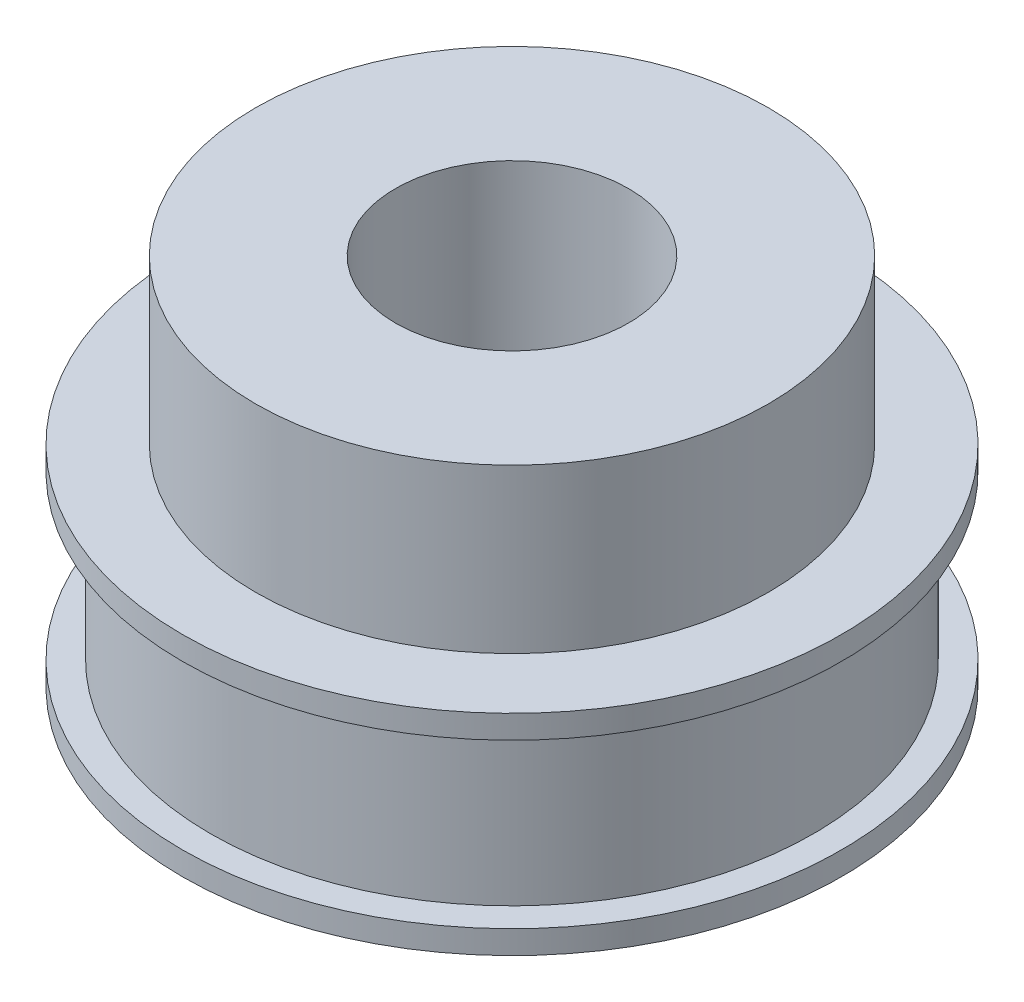
ISO-10303-21;
HEADER;
FILE_DESCRIPTION(('STEP AP214'),'2;1');
FILE_NAME('part.step','',(''),(''),'','','');
FILE_SCHEMA(('AUTOMOTIVE_DESIGN { 1 0 10303 214 1 1 1 1 }'));
ENDSEC;
DATA;
#1=APPLICATION_CONTEXT('core data for automotive mechanical design processes');
#2=APPLICATION_PROTOCOL_DEFINITION('international standard','automotive_design',2000,#1);
#3=PRODUCT_CONTEXT('',#1,'mechanical');
#4=PRODUCT('Part','Part','',(#3));
#5=PRODUCT_RELATED_PRODUCT_CATEGORY('part','',(#4));
#6=PRODUCT_DEFINITION_FORMATION('','',#4);
#7=PRODUCT_DEFINITION_CONTEXT('part definition',#1,'design');
#8=PRODUCT_DEFINITION('design','',#6,#7);
#9=PRODUCT_DEFINITION_SHAPE('','',#8);
#10=(LENGTH_UNIT() NAMED_UNIT(*) SI_UNIT(.MILLI.,.METRE.));
#11=(NAMED_UNIT(*) PLANE_ANGLE_UNIT() SI_UNIT($,.RADIAN.));
#12=(NAMED_UNIT(*) SI_UNIT($,.STERADIAN.) SOLID_ANGLE_UNIT());
#13=UNCERTAINTY_MEASURE_WITH_UNIT(LENGTH_MEASURE(1.E-05),#10,'distance_accuracy_value','');
#14=(GEOMETRIC_REPRESENTATION_CONTEXT(3) GLOBAL_UNCERTAINTY_ASSIGNED_CONTEXT((#13)) GLOBAL_UNIT_ASSIGNED_CONTEXT((#10,
#11,#12)) REPRESENTATION_CONTEXT('',''));
#15=CARTESIAN_POINT('',(0.,0.,0.));
#16=DIRECTION('',(0.,0.,1.));
#17=DIRECTION('',(1.,0.,0.));
#18=AXIS2_PLACEMENT_3D('',#15,#16,#17);
#19=CARTESIAN_POINT('',(0.,7.,0.));
#20=DIRECTION('',(0.,-1.,0.));
#21=DIRECTION('',(0.,0.,-1.));
#22=AXIS2_PLACEMENT_3D('',#19,#20,#21);
#23=CYLINDRICAL_SURFACE('',#22,12.935);
#24=CARTESIAN_POINT('',(0.,7.,0.));
#25=DIRECTION('',(0.,1.,0.));
#26=DIRECTION('',(0.,0.,1.));
#27=AXIS2_PLACEMENT_3D('',#24,#25,#26);
#28=CIRCLE('',#27,12.935);
#29=CARTESIAN_POINT('',(0.,7.,12.935));
#30=VERTEX_POINT('',#29);
#31=EDGE_CURVE('E42',#30,#30,#28,.T.);
#32=ORIENTED_EDGE('',*,*,#31,.F.);
#33=EDGE_LOOP('',(#32));
#34=FACE_BOUND('',#33,.T.);
#35=CARTESIAN_POINT('',(0.,0.,0.));
#36=DIRECTION('',(0.,1.,0.));
#37=DIRECTION('',(0.,0.,1.));
#38=AXIS2_PLACEMENT_3D('',#35,#36,#37);
#39=CIRCLE('',#38,12.935);
#40=CARTESIAN_POINT('',(0.,0.,12.935));
#41=VERTEX_POINT('',#40);
#42=EDGE_CURVE('E38',#41,#41,#39,.T.);
#43=ORIENTED_EDGE('',*,*,#42,.T.);
#44=EDGE_LOOP('',(#43));
#45=FACE_BOUND('',#44,.T.);
#46=ADVANCED_FACE('F35',(#34,#45),#23,.T.);
#47=CARTESIAN_POINT('',(0.,8.,0.));
#48=DIRECTION('',(0.,-1.,0.));
#49=DIRECTION('',(0.,0.,-1.));
#50=AXIS2_PLACEMENT_3D('',#47,#48,#49);
#51=CYLINDRICAL_SURFACE('',#50,14.135);
#52=CARTESIAN_POINT('',(0.,8.,0.));
#53=DIRECTION('',(0.,1.,0.));
#54=DIRECTION('',(0.,0.,1.));
#55=AXIS2_PLACEMENT_3D('',#52,#53,#54);
#56=CIRCLE('',#55,14.135);
#57=CARTESIAN_POINT('',(0.,8.,14.135));
#58=VERTEX_POINT('',#57);
#59=EDGE_CURVE('E47',#58,#58,#56,.T.);
#60=ORIENTED_EDGE('',*,*,#59,.F.);
#61=EDGE_LOOP('',(#60));
#62=FACE_BOUND('',#61,.T.);
#63=CARTESIAN_POINT('',(0.,7.,0.));
#64=DIRECTION('',(0.,1.,0.));
#65=DIRECTION('',(0.,0.,1.));
#66=AXIS2_PLACEMENT_3D('',#63,#64,#65);
#67=CIRCLE('',#66,14.135);
#68=CARTESIAN_POINT('',(0.,7.,14.135));
#69=VERTEX_POINT('',#68);
#70=EDGE_CURVE('E64',#69,#69,#67,.T.);
#71=ORIENTED_EDGE('',*,*,#70,.T.);
#72=EDGE_LOOP('',(#71));
#73=FACE_BOUND('',#72,.T.);
#74=ADVANCED_FACE('F96',(#62,#73),#51,.T.);
#75=CARTESIAN_POINT('',(0.,8.,0.));
#76=DIRECTION('',(0.,1.,0.));
#77=DIRECTION('',(0.,0.,1.));
#78=AXIS2_PLACEMENT_3D('',#75,#76,#77);
#79=PLANE('',#78);
#80=CARTESIAN_POINT('',(0.,8.,0.));
#81=DIRECTION('',(0.,1.,0.));
#82=DIRECTION('',(0.,0.,1.));
#83=AXIS2_PLACEMENT_3D('',#80,#81,#82);
#84=CIRCLE('',#83,11.);
#85=CARTESIAN_POINT('',(0.,8.,-11.));
#86=VERTEX_POINT('',#85);
#87=EDGE_CURVE('E11',#86,#86,#84,.T.);
#88=ORIENTED_EDGE('',*,*,#87,.F.);
#89=EDGE_LOOP('',(#88));
#90=FACE_BOUND('',#89,.T.);
#91=ORIENTED_EDGE('',*,*,#59,.T.);
#92=EDGE_LOOP('',(#91));
#93=FACE_BOUND('',#92,.T.);
#94=ADVANCED_FACE('F91',(#90,#93),#79,.T.);
#95=CARTESIAN_POINT('',(0.,7.,0.));
#96=DIRECTION('',(0.,1.,0.));
#97=DIRECTION('',(0.,0.,1.));
#98=AXIS2_PLACEMENT_3D('',#95,#96,#97);
#99=PLANE('',#98);
#100=ORIENTED_EDGE('',*,*,#31,.T.);
#101=EDGE_LOOP('',(#100));
#102=FACE_BOUND('',#101,.T.);
#103=ORIENTED_EDGE('',*,*,#70,.F.);
#104=EDGE_LOOP('',(#103));
#105=FACE_BOUND('',#104,.T.);
#106=ADVANCED_FACE('F82',(#102,#105),#99,.F.);
#107=CARTESIAN_POINT('',(0.,-1.,0.));
#108=DIRECTION('',(0.,1.,0.));
#109=DIRECTION('',(0.,0.,1.));
#110=AXIS2_PLACEMENT_3D('',#107,#108,#109);
#111=CYLINDRICAL_SURFACE('',#110,14.135);
#112=CARTESIAN_POINT('',(0.,-1.,0.));
#113=DIRECTION('',(0.,1.,0.));
#114=DIRECTION('',(0.,0.,1.));
#115=AXIS2_PLACEMENT_3D('',#112,#113,#114);
#116=CIRCLE('',#115,14.135);
#117=CARTESIAN_POINT('',(0.,-1.,14.135));
#118=VERTEX_POINT('',#117);
#119=EDGE_CURVE('E57',#118,#118,#116,.T.);
#120=ORIENTED_EDGE('',*,*,#119,.T.);
#121=EDGE_LOOP('',(#120));
#122=FACE_BOUND('',#121,.T.);
#123=CARTESIAN_POINT('',(0.,0.,0.));
#124=DIRECTION('',(0.,1.,0.));
#125=DIRECTION('',(0.,0.,1.));
#126=AXIS2_PLACEMENT_3D('',#123,#124,#125);
#127=CIRCLE('',#126,14.135);
#128=CARTESIAN_POINT('',(0.,0.,14.135));
#129=VERTEX_POINT('',#128);
#130=EDGE_CURVE('E55',#129,#129,#127,.T.);
#131=ORIENTED_EDGE('',*,*,#130,.F.);
#132=EDGE_LOOP('',(#131));
#133=FACE_BOUND('',#132,.T.);
#134=ADVANCED_FACE('F80',(#122,#133),#111,.T.);
#135=CARTESIAN_POINT('',(0.,-1.,0.));
#136=DIRECTION('',(0.,-1.,0.));
#137=DIRECTION('',(0.,0.,1.));
#138=AXIS2_PLACEMENT_3D('',#135,#136,#137);
#139=PLANE('',#138);
#140=CARTESIAN_POINT('',(0.,-1.,0.));
#141=DIRECTION('',(0.,1.,0.));
#142=DIRECTION('',(0.,0.,1.));
#143=AXIS2_PLACEMENT_3D('',#140,#141,#142);
#144=CIRCLE('',#143,5.);
#145=CARTESIAN_POINT('',(0.,-1.,5.));
#146=VERTEX_POINT('',#145);
#147=EDGE_CURVE('E56',#146,#146,#144,.T.);
#148=ORIENTED_EDGE('',*,*,#147,.T.);
#149=EDGE_LOOP('',(#148));
#150=FACE_BOUND('',#149,.T.);
#151=ORIENTED_EDGE('',*,*,#119,.F.);
#152=EDGE_LOOP('',(#151));
#153=FACE_BOUND('',#152,.T.);
#154=ADVANCED_FACE('F76',(#150,#153),#139,.T.);
#155=CARTESIAN_POINT('',(0.,0.,0.));
#156=DIRECTION('',(0.,-1.,0.));
#157=DIRECTION('',(0.,0.,1.));
#158=AXIS2_PLACEMENT_3D('',#155,#156,#157);
#159=PLANE('',#158);
#160=ORIENTED_EDGE('',*,*,#42,.F.);
#161=EDGE_LOOP('',(#160));
#162=FACE_BOUND('',#161,.T.);
#163=ORIENTED_EDGE('',*,*,#130,.T.);
#164=EDGE_LOOP('',(#163));
#165=FACE_BOUND('',#164,.T.);
#166=ADVANCED_FACE('F72',(#162,#165),#159,.F.);
#167=CARTESIAN_POINT('',(0.,62.1126983722081,0.));
#168=DIRECTION('',(0.,-1.,0.));
#169=DIRECTION('',(0.,0.,-1.));
#170=AXIS2_PLACEMENT_3D('',#167,#168,#169);
#171=CYLINDRICAL_SURFACE('',#170,11.);
#172=CARTESIAN_POINT('',(0.,15.,0.));
#173=DIRECTION('',(0.,-1.,0.));
#174=DIRECTION('',(0.,0.,-1.));
#175=AXIS2_PLACEMENT_3D('',#172,#173,#174);
#176=CIRCLE('',#175,11.);
#177=CARTESIAN_POINT('',(0.,15.,-11.));
#178=VERTEX_POINT('',#177);
#179=EDGE_CURVE('E52',#178,#178,#176,.T.);
#180=CARTESIAN_POINT('',(0.,15.,-11.));
#181=CARTESIAN_POINT('',(0.,14.9270833333333,-11.));
#182=CARTESIAN_POINT('',(0.,14.8541666666667,-11.));
#183=CARTESIAN_POINT('',(0.,14.7083333333333,-11.));
#184=CARTESIAN_POINT('',(0.,14.6354166666667,-11.));
#185=CARTESIAN_POINT('',(0.,14.4895833333333,-11.));
#186=CARTESIAN_POINT('',(0.,14.4166666666667,-11.));
#187=CARTESIAN_POINT('',(0.,14.2708333333333,-11.));
#188=CARTESIAN_POINT('',(0.,14.1979166666667,-11.));
#189=CARTESIAN_POINT('',(0.,14.0520833333333,-11.));
#190=CARTESIAN_POINT('',(0.,13.9791666666667,-11.));
#191=CARTESIAN_POINT('',(0.,13.8333333333333,-11.));
#192=CARTESIAN_POINT('',(0.,13.7604166666667,-11.));
#193=CARTESIAN_POINT('',(0.,13.6145833333333,-11.));
#194=CARTESIAN_POINT('',(0.,13.5416666666667,-11.));
#195=CARTESIAN_POINT('',(0.,13.3958333333333,-11.));
#196=CARTESIAN_POINT('',(0.,13.3229166666667,-11.));
#197=CARTESIAN_POINT('',(0.,13.1770833333333,-11.));
#198=CARTESIAN_POINT('',(0.,13.1041666666667,-11.));
#199=CARTESIAN_POINT('',(0.,12.9583333333333,-11.));
#200=CARTESIAN_POINT('',(0.,12.8854166666667,-11.));
#201=CARTESIAN_POINT('',(0.,12.7395833333333,-11.));
#202=CARTESIAN_POINT('',(0.,12.6666666666667,-11.));
#203=CARTESIAN_POINT('',(0.,12.5208333333333,-11.));
#204=CARTESIAN_POINT('',(0.,12.4479166666667,-11.));
#205=CARTESIAN_POINT('',(0.,12.3020833333333,-11.));
#206=CARTESIAN_POINT('',(0.,12.2291666666667,-11.));
#207=CARTESIAN_POINT('',(0.,12.0833333333333,-11.));
#208=CARTESIAN_POINT('',(0.,12.0104166666667,-11.));
#209=CARTESIAN_POINT('',(0.,11.8645833333333,-11.));
#210=CARTESIAN_POINT('',(0.,11.7916666666667,-11.));
#211=CARTESIAN_POINT('',(0.,11.6458333333333,-11.));
#212=CARTESIAN_POINT('',(0.,11.5729166666667,-11.));
#213=CARTESIAN_POINT('',(0.,11.4270833333333,-11.));
#214=CARTESIAN_POINT('',(0.,11.3541666666667,-11.));
#215=CARTESIAN_POINT('',(0.,11.2083333333333,-11.));
#216=CARTESIAN_POINT('',(0.,11.1354166666667,-11.));
#217=CARTESIAN_POINT('',(0.,10.9895833333333,-11.));
#218=CARTESIAN_POINT('',(0.,10.9166666666667,-11.));
#219=CARTESIAN_POINT('',(0.,10.7708333333333,-11.));
#220=CARTESIAN_POINT('',(0.,10.6979166666667,-11.));
#221=CARTESIAN_POINT('',(0.,10.5520833333333,-11.));
#222=CARTESIAN_POINT('',(0.,10.4791666666667,-11.));
#223=CARTESIAN_POINT('',(0.,10.3333333333333,-11.));
#224=CARTESIAN_POINT('',(0.,10.2604166666667,-11.));
#225=CARTESIAN_POINT('',(0.,10.1145833333333,-11.));
#226=CARTESIAN_POINT('',(0.,10.0416666666667,-11.));
#227=CARTESIAN_POINT('',(0.,9.89583333333334,-11.));
#228=CARTESIAN_POINT('',(0.,9.82291666666667,-11.));
#229=CARTESIAN_POINT('',(0.,9.67708333333333,-11.));
#230=CARTESIAN_POINT('',(0.,9.60416666666667,-11.));
#231=CARTESIAN_POINT('',(0.,9.45833333333333,-11.));
#232=CARTESIAN_POINT('',(0.,9.38541666666667,-11.));
#233=CARTESIAN_POINT('',(0.,9.23958333333334,-11.));
#234=CARTESIAN_POINT('',(0.,9.16666666666667,-11.));
#235=CARTESIAN_POINT('',(0.,9.02083333333334,-11.));
#236=CARTESIAN_POINT('',(0.,8.94791666666667,-11.));
#237=CARTESIAN_POINT('',(0.,8.80208333333333,-11.));
#238=CARTESIAN_POINT('',(0.,8.72916666666666,-11.));
#239=CARTESIAN_POINT('',(0.,8.58333333333333,-11.));
#240=CARTESIAN_POINT('',(0.,8.51041666666667,-11.));
#241=CARTESIAN_POINT('',(0.,8.36458333333334,-11.));
#242=CARTESIAN_POINT('',(0.,8.29166666666667,-11.));
#243=CARTESIAN_POINT('',(0.,8.14583333333334,-11.));
#244=CARTESIAN_POINT('',(0.,8.07291666666667,-11.));
#245=CARTESIAN_POINT('',(0.,8.,-11.));
#246=B_SPLINE_CURVE_WITH_KNOTS('',3,(#180,#181,#182,#183,#184,#185,#186,#187,#188,#189,#190,
#191,#192,#193,#194,#195,#196,#197,#198,#199,#200,#201,#202,#203,#204,#205,#206,#207,#208,#209,
#210,#211,#212,#213,#214,#215,#216,#217,#218,#219,#220,#221,#222,#223,#224,#225,#226,#227,#228,
#229,#230,#231,#232,#233,#234,#235,#236,#237,#238,#239,#240,#241,#242,#243,#244,#245),
.UNSPECIFIED.,.F.,.F.,(4,2,2,2,2,2,2,2,2,2,2,2,2,2,2,2,2,2,2,2,2,2,2,2,2,2,2,2,2,2,2,2,4),(0.,
0.218750000000004,0.4375,0.656249999999997,0.875000000000001,1.09375,1.3125,1.53125,1.75,
1.96875000000001,2.1875,2.40625,2.625,2.84375000000001,3.0625,3.28125,3.5,3.71875000000001,
3.9375,4.15625,4.375,4.59375000000001,4.8125,5.03125,5.25,5.46875000000001,5.68750000000001,
5.90625,6.12500000000001,6.34375000000001,6.56250000000001,6.78125,7.00000000000001),.UNSPECIFIED.);
#247=EDGE_CURVE('BSEAM75',#178,#86,#246,.T.);
#248=ORIENTED_EDGE('',*,*,#179,.T.);
#249=ORIENTED_EDGE('',*,*,#87,.T.);
#250=ORIENTED_EDGE('',*,*,#247,.T.);
#251=ORIENTED_EDGE('',*,*,#247,.F.);
#252=EDGE_LOOP('',(#248,#250,#249,#251));
#253=FACE_BOUND('',#252,.T.);
#254=ADVANCED_FACE('F75',(#253),#171,.T.);
#255=CARTESIAN_POINT('',(0.,15.,0.));
#256=DIRECTION('',(0.,-1.,0.));
#257=DIRECTION('',(0.,0.,1.));
#258=AXIS2_PLACEMENT_3D('',#255,#256,#257);
#259=PLANE('',#258);
#260=CARTESIAN_POINT('',(0.,15.,0.));
#261=DIRECTION('',(0.,1.,0.));
#262=DIRECTION('',(0.,0.,1.));
#263=AXIS2_PLACEMENT_3D('',#260,#261,#262);
#264=CIRCLE('',#263,5.);
#265=CARTESIAN_POINT('',(0.,15.,5.));
#266=VERTEX_POINT('',#265);
#267=EDGE_CURVE('E50',#266,#266,#264,.T.);
#268=ORIENTED_EDGE('',*,*,#267,.F.);
#269=EDGE_LOOP('',(#268));
#270=FACE_BOUND('',#269,.T.);
#271=ORIENTED_EDGE('',*,*,#179,.F.);
#272=EDGE_LOOP('',(#271));
#273=FACE_BOUND('',#272,.T.);
#274=ADVANCED_FACE('F140',(#270,#273),#259,.F.);
#275=CARTESIAN_POINT('',(0.,-1.,0.));
#276=DIRECTION('',(0.,1.,0.));
#277=DIRECTION('',(0.,0.,1.));
#278=AXIS2_PLACEMENT_3D('',#275,#276,#277);
#279=CYLINDRICAL_SURFACE('',#278,5.);
#280=ORIENTED_EDGE('',*,*,#147,.F.);
#281=EDGE_LOOP('',(#280));
#282=FACE_BOUND('',#281,.T.);
#283=ORIENTED_EDGE('',*,*,#267,.T.);
#284=EDGE_LOOP('',(#283));
#285=FACE_BOUND('',#284,.T.);
#286=ADVANCED_FACE('F147',(#282,#285),#279,.F.);
#287=CLOSED_SHELL('',(#46,#74,#94,#106,#134,#154,#166,#254,#274,#286));
#288=MANIFOLD_SOLID_BREP('B2',#287);
#289=ADVANCED_BREP_SHAPE_REPRESENTATION('',(#18,#288),#14);
#290=SHAPE_DEFINITION_REPRESENTATION(#9,#289);
ENDSEC;
END-ISO-10303-21;
